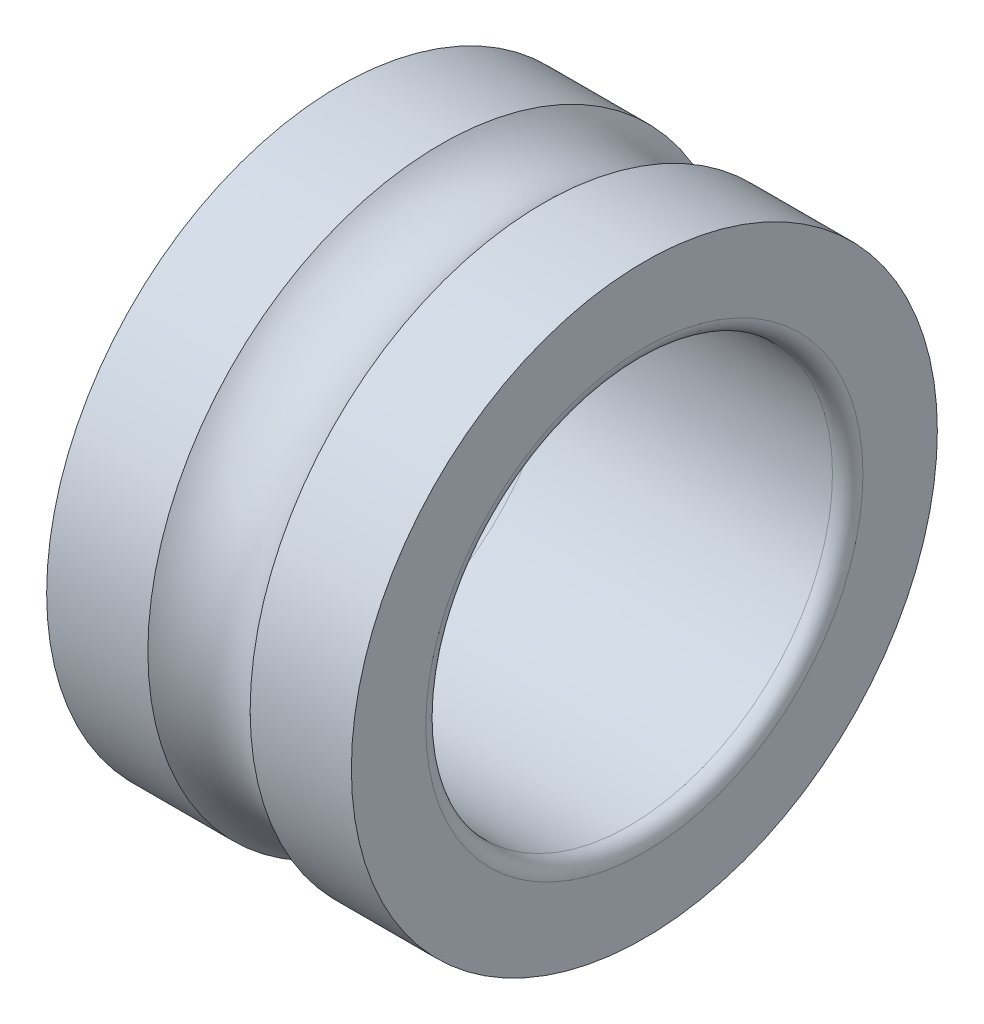
ISO-10303-21;
HEADER;
FILE_DESCRIPTION(('STEP AP214'),'2;1');
FILE_NAME('part.step','',(''),(''),'','','');
FILE_SCHEMA(('AUTOMOTIVE_DESIGN { 1 0 10303 214 1 1 1 1 }'));
ENDSEC;
DATA;
#1=APPLICATION_CONTEXT('core data for automotive mechanical design processes');
#2=APPLICATION_PROTOCOL_DEFINITION('international standard','automotive_design',2000,#1);
#3=PRODUCT_CONTEXT('',#1,'mechanical');
#4=PRODUCT('Part','Part','',(#3));
#5=PRODUCT_RELATED_PRODUCT_CATEGORY('part','',(#4));
#6=PRODUCT_DEFINITION_FORMATION('','',#4);
#7=PRODUCT_DEFINITION_CONTEXT('part definition',#1,'design');
#8=PRODUCT_DEFINITION('design','',#6,#7);
#9=PRODUCT_DEFINITION_SHAPE('','',#8);
#10=(LENGTH_UNIT() NAMED_UNIT(*) SI_UNIT(.MILLI.,.METRE.));
#11=(NAMED_UNIT(*) PLANE_ANGLE_UNIT() SI_UNIT($,.RADIAN.));
#12=(NAMED_UNIT(*) SI_UNIT($,.STERADIAN.) SOLID_ANGLE_UNIT());
#13=UNCERTAINTY_MEASURE_WITH_UNIT(LENGTH_MEASURE(1.E-05),#10,'distance_accuracy_value','');
#14=(GEOMETRIC_REPRESENTATION_CONTEXT(3) GLOBAL_UNCERTAINTY_ASSIGNED_CONTEXT((#13)) GLOBAL_UNIT_ASSIGNED_CONTEXT((#10,
#11,#12)) REPRESENTATION_CONTEXT('',''));
#15=CARTESIAN_POINT('',(0.,0.,0.));
#16=DIRECTION('',(0.,0.,1.));
#17=DIRECTION('',(1.,0.,0.));
#18=AXIS2_PLACEMENT_3D('',#15,#16,#17);
#19=CARTESIAN_POINT('',(0.,0.,0.));
#20=DIRECTION('',(1.,0.,0.));
#21=DIRECTION('',(0.,-1.,0.));
#22=AXIS2_PLACEMENT_3D('',#19,#20,#21);
#23=TOROIDAL_SURFACE('',#22,6.75005,1.408684);
#24=CARTESIAN_POINT('',(1.00600159644334,0.,0.));
#25=DIRECTION('',(1.,0.,0.));
#26=DIRECTION('',(0.,0.,-1.));
#27=AXIS2_PLACEMENT_3D('',#24,#25,#26);
#28=CIRCLE('',#27,5.7639712);
#29=CARTESIAN_POINT('',(1.00600159644334,0.,-5.7639712));
#30=VERTEX_POINT('',#29);
#31=EDGE_CURVE('E151',#30,#30,#28,.T.);
#32=ORIENTED_EDGE('',*,*,#31,.F.);
#33=EDGE_LOOP('',(#32));
#34=FACE_BOUND('',#33,.T.);
#35=CARTESIAN_POINT('',(-1.00600159644334,0.,0.));
#36=DIRECTION('',(1.,0.,0.));
#37=DIRECTION('',(0.,0.,-1.));
#38=AXIS2_PLACEMENT_3D('',#35,#36,#37);
#39=CIRCLE('',#38,5.7639712);
#40=CARTESIAN_POINT('',(-1.00600159644334,0.,-5.7639712));
#41=VERTEX_POINT('',#40);
#42=EDGE_CURVE('E149',#41,#41,#39,.F.);
#43=ORIENTED_EDGE('',*,*,#42,.F.);
#44=EDGE_LOOP('',(#43));
#45=FACE_BOUND('',#44,.T.);
#46=ADVANCED_FACE('F17',(#34,#45),#23,.F.);
#47=CARTESIAN_POINT('',(-3.29692,0.,0.));
#48=DIRECTION('',(1.,0.,0.));
#49=DIRECTION('',(0.,0.,-1.));
#50=AXIS2_PLACEMENT_3D('',#47,#48,#49);
#51=CYLINDRICAL_SURFACE('',#50,5.7639712);
#52=CARTESIAN_POINT('',(2.9972,0.,0.));
#53=DIRECTION('',(1.,0.,0.));
#54=DIRECTION('',(0.,0.,-1.));
#55=AXIS2_PLACEMENT_3D('',#52,#53,#54);
#56=CIRCLE('',#55,5.7639712);
#57=CARTESIAN_POINT('',(2.9972,0.,-5.7639712));
#58=VERTEX_POINT('',#57);
#59=EDGE_CURVE('E56',#58,#58,#56,.T.);
#60=ORIENTED_EDGE('',*,*,#59,.F.);
#61=EDGE_LOOP('',(#60));
#62=FACE_BOUND('',#61,.T.);
#63=ORIENTED_EDGE('',*,*,#31,.T.);
#64=EDGE_LOOP('',(#63));
#65=FACE_BOUND('',#64,.T.);
#66=ADVANCED_FACE('F87',(#62,#65),#51,.T.);
#67=CARTESIAN_POINT('',(-3.29692,0.,0.));
#68=DIRECTION('',(1.,0.,0.));
#69=DIRECTION('',(0.,0.,-1.));
#70=AXIS2_PLACEMENT_3D('',#67,#68,#69);
#71=CYLINDRICAL_SURFACE('',#70,5.7639712);
#72=ORIENTED_EDGE('',*,*,#42,.T.);
#73=EDGE_LOOP('',(#72));
#74=FACE_BOUND('',#73,.T.);
#75=CARTESIAN_POINT('',(-2.9972,0.,0.));
#76=DIRECTION('',(1.,0.,0.));
#77=DIRECTION('',(0.,0.,-1.));
#78=AXIS2_PLACEMENT_3D('',#75,#76,#77);
#79=CIRCLE('',#78,5.7639712);
#80=CARTESIAN_POINT('',(-2.9972,0.,-5.7639712));
#81=VERTEX_POINT('',#80);
#82=EDGE_CURVE('E62',#81,#81,#79,.T.);
#83=ORIENTED_EDGE('',*,*,#82,.T.);
#84=EDGE_LOOP('',(#83));
#85=FACE_BOUND('',#84,.T.);
#86=ADVANCED_FACE('F81',(#74,#85),#71,.T.);
#87=CARTESIAN_POINT('',(2.9972,0.,0.));
#88=DIRECTION('',(1.,0.,0.));
#89=DIRECTION('',(0.,0.,-1.));
#90=AXIS2_PLACEMENT_3D('',#87,#88,#89);
#91=PLANE('',#90);
#92=ORIENTED_EDGE('',*,*,#59,.T.);
#93=EDGE_LOOP('',(#92));
#94=FACE_BOUND('',#93,.T.);
#95=CARTESIAN_POINT('',(2.9972,0.,0.));
#96=DIRECTION('',(1.,0.,0.));
#97=DIRECTION('',(0.,1.,0.));
#98=AXIS2_PLACEMENT_3D('',#95,#96,#97);
#99=CIRCLE('',#98,4.30022);
#100=CARTESIAN_POINT('',(2.9972,4.30022,0.));
#101=VERTEX_POINT('',#100);
#102=CARTESIAN_POINT('',(2.9972,-4.30022,0.));
#103=VERTEX_POINT('',#102);
#104=EDGE_CURVE('E47',#101,#103,#99,.T.);
#105=ORIENTED_EDGE('',*,*,#104,.F.);
#106=CARTESIAN_POINT('',(2.9972,0.,0.));
#107=DIRECTION('',(1.,0.,0.));
#108=DIRECTION('',(0.,-1.,0.));
#109=AXIS2_PLACEMENT_3D('',#106,#107,#108);
#110=CIRCLE('',#109,4.30022);
#111=EDGE_CURVE('E52',#103,#101,#110,.T.);
#112=ORIENTED_EDGE('',*,*,#111,.F.);
#113=EDGE_LOOP('',(#105,#112));
#114=FACE_BOUND('',#113,.T.);
#115=ADVANCED_FACE('F60',(#94,#114),#91,.T.);
#116=CARTESIAN_POINT('',(-2.9972,0.,0.));
#117=DIRECTION('',(1.,0.,0.));
#118=DIRECTION('',(0.,0.,-1.));
#119=AXIS2_PLACEMENT_3D('',#116,#117,#118);
#120=PLANE('',#119);
#121=ORIENTED_EDGE('',*,*,#82,.F.);
#122=EDGE_LOOP('',(#121));
#123=FACE_BOUND('',#122,.T.);
#124=CARTESIAN_POINT('',(-2.9972,0.,0.));
#125=DIRECTION('',(-1.,0.,0.));
#126=DIRECTION('',(0.,-1.,0.));
#127=AXIS2_PLACEMENT_3D('',#124,#125,#126);
#128=CIRCLE('',#127,4.30022);
#129=CARTESIAN_POINT('',(-2.9972,-4.30022,0.));
#130=VERTEX_POINT('',#129);
#131=CARTESIAN_POINT('',(-2.9972,4.30022,0.));
#132=VERTEX_POINT('',#131);
#133=EDGE_CURVE('E35',#130,#132,#128,.T.);
#134=ORIENTED_EDGE('',*,*,#133,.F.);
#135=CARTESIAN_POINT('',(-2.9972,0.,0.));
#136=DIRECTION('',(-1.,0.,0.));
#137=DIRECTION('',(0.,1.,0.));
#138=AXIS2_PLACEMENT_3D('',#135,#136,#137);
#139=CIRCLE('',#138,4.30022);
#140=EDGE_CURVE('E61',#132,#130,#139,.T.);
#141=ORIENTED_EDGE('',*,*,#140,.F.);
#142=EDGE_LOOP('',(#134,#141));
#143=FACE_BOUND('',#142,.T.);
#144=ADVANCED_FACE('F80',(#123,#143),#120,.F.);
#145=CARTESIAN_POINT('',(2.69748,0.,0.));
#146=DIRECTION('',(1.,0.,0.));
#147=DIRECTION('',(0.,-1.,0.));
#148=AXIS2_PLACEMENT_3D('',#145,#146,#147);
#149=TOROIDAL_SURFACE('',#148,4.30022,0.29972);
#150=ORIENTED_EDGE('',*,*,#104,.T.);
#151=ORIENTED_EDGE('',*,*,#111,.T.);
#152=EDGE_LOOP('',(#150,#151));
#153=FACE_BOUND('',#152,.T.);
#154=CARTESIAN_POINT('',(2.69748,0.,0.));
#155=DIRECTION('',(1.,0.,0.));
#156=DIRECTION('',(0.,0.,-1.));
#157=AXIS2_PLACEMENT_3D('',#154,#155,#156);
#158=CIRCLE('',#157,4.0005);
#159=CARTESIAN_POINT('',(2.69748,0.,-4.0005));
#160=VERTEX_POINT('',#159);
#161=EDGE_CURVE('E28',#160,#160,#158,.F.);
#162=ORIENTED_EDGE('',*,*,#161,.T.);
#163=EDGE_LOOP('',(#162));
#164=FACE_BOUND('',#163,.T.);
#165=ADVANCED_FACE('F50',(#153,#164),#149,.T.);
#166=CARTESIAN_POINT('',(-2.69748,0.,0.));
#167=DIRECTION('',(1.,0.,0.));
#168=DIRECTION('',(0.,-1.,0.));
#169=AXIS2_PLACEMENT_3D('',#166,#167,#168);
#170=TOROIDAL_SURFACE('',#169,4.30022,0.29972);
#171=ORIENTED_EDGE('',*,*,#140,.T.);
#172=ORIENTED_EDGE('',*,*,#133,.T.);
#173=EDGE_LOOP('',(#171,#172));
#174=FACE_BOUND('',#173,.T.);
#175=CARTESIAN_POINT('',(-2.69748,0.,0.));
#176=DIRECTION('',(1.,0.,0.));
#177=DIRECTION('',(0.,0.,-1.));
#178=AXIS2_PLACEMENT_3D('',#175,#176,#177);
#179=CIRCLE('',#178,4.0005);
#180=CARTESIAN_POINT('',(-2.69748,0.,-4.0005));
#181=VERTEX_POINT('',#180);
#182=EDGE_CURVE('E11',#181,#181,#179,.T.);
#183=ORIENTED_EDGE('',*,*,#182,.T.);
#184=EDGE_LOOP('',(#183));
#185=FACE_BOUND('',#184,.T.);
#186=ADVANCED_FACE('F100',(#174,#185),#170,.T.);
#187=CARTESIAN_POINT('',(-3.29692,0.,0.));
#188=DIRECTION('',(1.,0.,0.));
#189=DIRECTION('',(0.,0.,-1.));
#190=AXIS2_PLACEMENT_3D('',#187,#188,#189);
#191=CYLINDRICAL_SURFACE('',#190,4.0005);
#192=ORIENTED_EDGE('',*,*,#161,.F.);
#193=EDGE_LOOP('',(#192));
#194=FACE_BOUND('',#193,.T.);
#195=ORIENTED_EDGE('',*,*,#182,.F.);
#196=EDGE_LOOP('',(#195));
#197=FACE_BOUND('',#196,.T.);
#198=ADVANCED_FACE('F98',(#194,#197),#191,.F.);
#199=CLOSED_SHELL('',(#46,#66,#86,#115,#144,#165,#186,#198));
#200=MANIFOLD_SOLID_BREP('B1',#199);
#201=ADVANCED_BREP_SHAPE_REPRESENTATION('',(#18,#200),#14);
#202=SHAPE_DEFINITION_REPRESENTATION(#9,#201);
ENDSEC;
END-ISO-10303-21;
